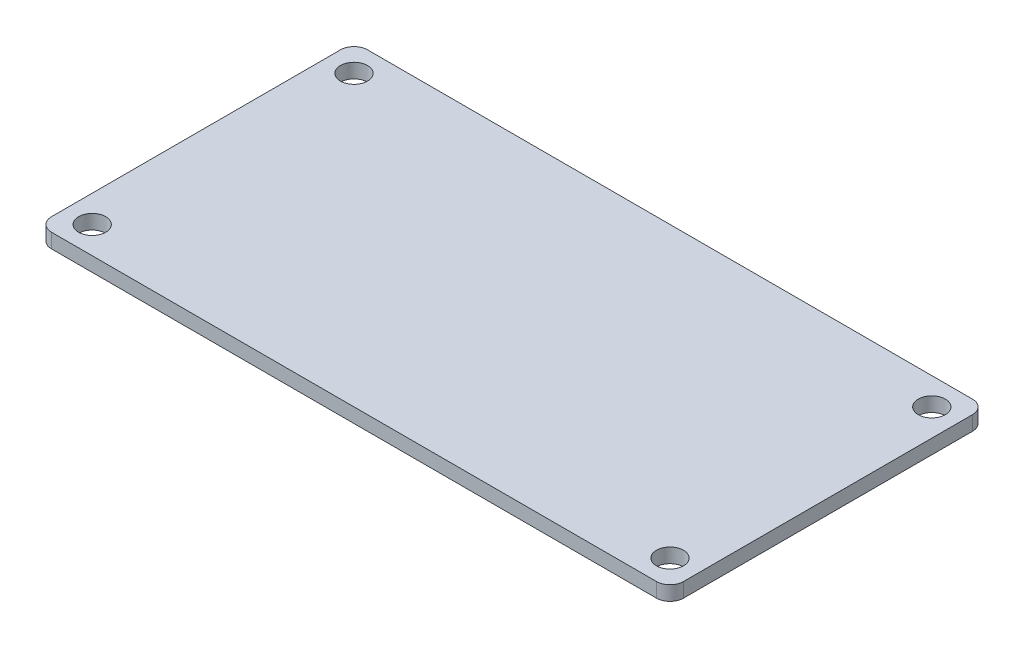
ISO-10303-21;
HEADER;
FILE_DESCRIPTION(('STEP AP214'),'2;1');
FILE_NAME('part.step','',(''),(''),'','','');
FILE_SCHEMA(('AUTOMOTIVE_DESIGN { 1 0 10303 214 1 1 1 1 }'));
ENDSEC;
DATA;
#1=APPLICATION_CONTEXT('core data for automotive mechanical design processes');
#2=APPLICATION_PROTOCOL_DEFINITION('international standard','automotive_design',2000,#1);
#3=PRODUCT_CONTEXT('',#1,'mechanical');
#4=PRODUCT('Part','Part','',(#3));
#5=PRODUCT_RELATED_PRODUCT_CATEGORY('part','',(#4));
#6=PRODUCT_DEFINITION_FORMATION('','',#4);
#7=PRODUCT_DEFINITION_CONTEXT('part definition',#1,'design');
#8=PRODUCT_DEFINITION('design','',#6,#7);
#9=PRODUCT_DEFINITION_SHAPE('','',#8);
#10=(LENGTH_UNIT() NAMED_UNIT(*) SI_UNIT(.MILLI.,.METRE.));
#11=(NAMED_UNIT(*) PLANE_ANGLE_UNIT() SI_UNIT($,.RADIAN.));
#12=(NAMED_UNIT(*) SI_UNIT($,.STERADIAN.) SOLID_ANGLE_UNIT());
#13=UNCERTAINTY_MEASURE_WITH_UNIT(LENGTH_MEASURE(1.E-05),#10,'distance_accuracy_value','');
#14=(GEOMETRIC_REPRESENTATION_CONTEXT(3) GLOBAL_UNCERTAINTY_ASSIGNED_CONTEXT((#13)) GLOBAL_UNIT_ASSIGNED_CONTEXT((#10,
#11,#12)) REPRESENTATION_CONTEXT('',''));
#15=CARTESIAN_POINT('',(0.,0.,0.));
#16=DIRECTION('',(0.,0.,1.));
#17=DIRECTION('',(1.,0.,0.));
#18=AXIS2_PLACEMENT_3D('',#15,#16,#17);
#19=CARTESIAN_POINT('',(-33.5,1.6,16.));
#20=DIRECTION('',(0.,-1.,0.));
#21=DIRECTION('',(0.,0.,-1.));
#22=AXIS2_PLACEMENT_3D('',#19,#20,#21);
#23=CYLINDRICAL_SURFACE('',#22,1.5);
#24=CARTESIAN_POINT('',(-33.5,0.,16.));
#25=DIRECTION('',(0.,1.,0.));
#26=DIRECTION('',(0.,0.,-1.));
#27=AXIS2_PLACEMENT_3D('',#24,#25,#26);
#28=CIRCLE('',#27,1.5);
#29=CARTESIAN_POINT('',(-35.,0.,16.));
#30=VERTEX_POINT('',#29);
#31=CARTESIAN_POINT('',(-33.5,0.,17.5));
#32=VERTEX_POINT('',#31);
#33=EDGE_CURVE('E131',#30,#32,#28,.T.);
#34=ORIENTED_EDGE('',*,*,#33,.T.);
#35=DIRECTION('',(0.,-1.,0.));
#36=VECTOR('',#35,1.);
#37=CARTESIAN_POINT('',(-33.5,1.6,17.5));
#38=LINE('',#37,#36);
#39=CARTESIAN_POINT('',(-33.5,1.6,17.5));
#40=VERTEX_POINT('',#39);
#41=EDGE_CURVE('E11',#40,#32,#38,.T.);
#42=ORIENTED_EDGE('',*,*,#41,.F.);
#43=CARTESIAN_POINT('',(-33.5,1.6,16.));
#44=DIRECTION('',(0.,1.,0.));
#45=DIRECTION('',(0.,0.,-1.));
#46=AXIS2_PLACEMENT_3D('',#43,#44,#45);
#47=CIRCLE('',#46,1.5);
#48=CARTESIAN_POINT('',(-35.,1.6,16.));
#49=VERTEX_POINT('',#48);
#50=EDGE_CURVE('E146',#49,#40,#47,.T.);
#51=ORIENTED_EDGE('',*,*,#50,.F.);
#52=DIRECTION('',(0.,-1.,0.));
#53=VECTOR('',#52,1.);
#54=CARTESIAN_POINT('',(-35.,1.6,16.));
#55=LINE('',#54,#53);
#56=EDGE_CURVE('E127',#49,#30,#55,.T.);
#57=ORIENTED_EDGE('',*,*,#56,.T.);
#58=EDGE_LOOP('',(#34,#42,#51,#57));
#59=FACE_BOUND('',#58,.T.);
#60=ADVANCED_FACE('F35',(#59),#23,.T.);
#61=CARTESIAN_POINT('',(-33.5,1.6,17.5));
#62=DIRECTION('',(0.,0.,-1.));
#63=DIRECTION('',(-1.,0.,0.));
#64=AXIS2_PLACEMENT_3D('',#61,#62,#63);
#65=PLANE('',#64);
#66=DIRECTION('',(1.,0.,0.));
#67=VECTOR('',#66,1.);
#68=CARTESIAN_POINT('',(-33.5,0.,17.5));
#69=LINE('',#68,#67);
#70=CARTESIAN_POINT('',(33.5,0.,17.5));
#71=VERTEX_POINT('',#70);
#72=EDGE_CURVE('E134',#32,#71,#69,.T.);
#73=ORIENTED_EDGE('',*,*,#72,.T.);
#74=DIRECTION('',(0.,-1.,0.));
#75=VECTOR('',#74,1.);
#76=CARTESIAN_POINT('',(33.5,1.6,17.5));
#77=LINE('',#76,#75);
#78=CARTESIAN_POINT('',(33.5,1.6,17.5));
#79=VERTEX_POINT('',#78);
#80=EDGE_CURVE('E43',#79,#71,#77,.T.);
#81=ORIENTED_EDGE('',*,*,#80,.F.);
#82=DIRECTION('',(1.,0.,0.));
#83=VECTOR('',#82,1.);
#84=CARTESIAN_POINT('',(-33.5,1.6,17.5));
#85=LINE('',#84,#83);
#86=EDGE_CURVE('E94',#40,#79,#85,.T.);
#87=ORIENTED_EDGE('',*,*,#86,.F.);
#88=ORIENTED_EDGE('',*,*,#41,.T.);
#89=EDGE_LOOP('',(#73,#81,#87,#88));
#90=FACE_BOUND('',#89,.T.);
#91=ADVANCED_FACE('F227',(#90),#65,.F.);
#92=CARTESIAN_POINT('',(33.5,1.6,16.));
#93=DIRECTION('',(0.,-1.,0.));
#94=DIRECTION('',(0.,0.,-1.));
#95=AXIS2_PLACEMENT_3D('',#92,#93,#94);
#96=CYLINDRICAL_SURFACE('',#95,1.5);
#97=CARTESIAN_POINT('',(33.5,0.,16.));
#98=DIRECTION('',(0.,1.,0.));
#99=DIRECTION('',(0.,0.,1.));
#100=AXIS2_PLACEMENT_3D('',#97,#98,#99);
#101=CIRCLE('',#100,1.5);
#102=CARTESIAN_POINT('',(35.,0.,16.));
#103=VERTEX_POINT('',#102);
#104=EDGE_CURVE('E137',#71,#103,#101,.T.);
#105=ORIENTED_EDGE('',*,*,#104,.T.);
#106=DIRECTION('',(0.,-1.,0.));
#107=VECTOR('',#106,1.);
#108=CARTESIAN_POINT('',(35.,1.6,16.));
#109=LINE('',#108,#107);
#110=CARTESIAN_POINT('',(35.,1.6,16.));
#111=VERTEX_POINT('',#110);
#112=EDGE_CURVE('E153',#111,#103,#109,.T.);
#113=ORIENTED_EDGE('',*,*,#112,.F.);
#114=CARTESIAN_POINT('',(33.5,1.6,16.));
#115=DIRECTION('',(0.,1.,0.));
#116=DIRECTION('',(0.,0.,1.));
#117=AXIS2_PLACEMENT_3D('',#114,#115,#116);
#118=CIRCLE('',#117,1.5);
#119=EDGE_CURVE('E161',#79,#111,#118,.T.);
#120=ORIENTED_EDGE('',*,*,#119,.F.);
#121=ORIENTED_EDGE('',*,*,#80,.T.);
#122=EDGE_LOOP('',(#105,#113,#120,#121));
#123=FACE_BOUND('',#122,.T.);
#124=ADVANCED_FACE('F159',(#123),#96,.T.);
#125=CARTESIAN_POINT('',(35.,1.6,16.));
#126=DIRECTION('',(-1.,0.,0.));
#127=DIRECTION('',(0.,0.,1.));
#128=AXIS2_PLACEMENT_3D('',#125,#126,#127);
#129=PLANE('',#128);
#130=DIRECTION('',(0.,0.,-1.));
#131=VECTOR('',#130,1.);
#132=CARTESIAN_POINT('',(35.,0.,16.));
#133=LINE('',#132,#131);
#134=CARTESIAN_POINT('',(35.,0.,-16.));
#135=VERTEX_POINT('',#134);
#136=EDGE_CURVE('E139',#103,#135,#133,.T.);
#137=ORIENTED_EDGE('',*,*,#136,.T.);
#138=DIRECTION('',(0.,-1.,0.));
#139=VECTOR('',#138,1.);
#140=CARTESIAN_POINT('',(35.,1.6,-16.));
#141=LINE('',#140,#139);
#142=CARTESIAN_POINT('',(35.,1.6,-16.));
#143=VERTEX_POINT('',#142);
#144=EDGE_CURVE('E150',#143,#135,#141,.T.);
#145=ORIENTED_EDGE('',*,*,#144,.F.);
#146=DIRECTION('',(0.,0.,-1.));
#147=VECTOR('',#146,1.);
#148=CARTESIAN_POINT('',(35.,1.6,16.));
#149=LINE('',#148,#147);
#150=EDGE_CURVE('E173',#111,#143,#149,.T.);
#151=ORIENTED_EDGE('',*,*,#150,.F.);
#152=ORIENTED_EDGE('',*,*,#112,.T.);
#153=EDGE_LOOP('',(#137,#145,#151,#152));
#154=FACE_BOUND('',#153,.T.);
#155=ADVANCED_FACE('F169',(#154),#129,.F.);
#156=CARTESIAN_POINT('',(33.5,1.6,-16.));
#157=DIRECTION('',(0.,-1.,0.));
#158=DIRECTION('',(0.,0.,-1.));
#159=AXIS2_PLACEMENT_3D('',#156,#157,#158);
#160=CYLINDRICAL_SURFACE('',#159,1.5);
#161=CARTESIAN_POINT('',(33.5,0.,-16.));
#162=DIRECTION('',(0.,1.,0.));
#163=DIRECTION('',(0.,0.,-1.));
#164=AXIS2_PLACEMENT_3D('',#161,#162,#163);
#165=CIRCLE('',#164,1.5);
#166=CARTESIAN_POINT('',(33.5,0.,-17.5));
#167=VERTEX_POINT('',#166);
#168=EDGE_CURVE('E141',#135,#167,#165,.T.);
#169=ORIENTED_EDGE('',*,*,#168,.T.);
#170=DIRECTION('',(0.,-1.,0.));
#171=VECTOR('',#170,1.);
#172=CARTESIAN_POINT('',(33.5,1.6,-17.5));
#173=LINE('',#172,#171);
#174=CARTESIAN_POINT('',(33.5,1.6,-17.5));
#175=VERTEX_POINT('',#174);
#176=EDGE_CURVE('E122',#175,#167,#173,.T.);
#177=ORIENTED_EDGE('',*,*,#176,.F.);
#178=CARTESIAN_POINT('',(33.5,1.6,-16.));
#179=DIRECTION('',(0.,1.,0.));
#180=DIRECTION('',(0.,0.,-1.));
#181=AXIS2_PLACEMENT_3D('',#178,#179,#180);
#182=CIRCLE('',#181,1.5);
#183=EDGE_CURVE('E113',#143,#175,#182,.T.);
#184=ORIENTED_EDGE('',*,*,#183,.F.);
#185=ORIENTED_EDGE('',*,*,#144,.T.);
#186=EDGE_LOOP('',(#169,#177,#184,#185));
#187=FACE_BOUND('',#186,.T.);
#188=ADVANCED_FACE('F172',(#187),#160,.T.);
#189=CARTESIAN_POINT('',(-33.5,1.6,-17.5));
#190=DIRECTION('',(0.,0.,1.));
#191=DIRECTION('',(1.,0.,0.));
#192=AXIS2_PLACEMENT_3D('',#189,#190,#191);
#193=PLANE('',#192);
#194=DIRECTION('',(-1.,0.,0.));
#195=VECTOR('',#194,1.);
#196=CARTESIAN_POINT('',(-33.5,0.,-17.5));
#197=LINE('',#196,#195);
#198=CARTESIAN_POINT('',(-33.5,0.,-17.5));
#199=VERTEX_POINT('',#198);
#200=EDGE_CURVE('E121',#167,#199,#197,.T.);
#201=ORIENTED_EDGE('',*,*,#200,.T.);
#202=DIRECTION('',(0.,-1.,0.));
#203=VECTOR('',#202,1.);
#204=CARTESIAN_POINT('',(-33.5,1.6,-17.5));
#205=LINE('',#204,#203);
#206=CARTESIAN_POINT('',(-33.5,1.6,-17.5));
#207=VERTEX_POINT('',#206);
#208=EDGE_CURVE('E118',#207,#199,#205,.T.);
#209=ORIENTED_EDGE('',*,*,#208,.F.);
#210=DIRECTION('',(-1.,0.,0.));
#211=VECTOR('',#210,1.);
#212=CARTESIAN_POINT('',(-33.5,1.6,-17.5));
#213=LINE('',#212,#211);
#214=EDGE_CURVE('E107',#175,#207,#213,.T.);
#215=ORIENTED_EDGE('',*,*,#214,.F.);
#216=ORIENTED_EDGE('',*,*,#176,.T.);
#217=EDGE_LOOP('',(#201,#209,#215,#216));
#218=FACE_BOUND('',#217,.T.);
#219=ADVANCED_FACE('F119',(#218),#193,.F.);
#220=CARTESIAN_POINT('',(-33.5,1.6,-16.));
#221=DIRECTION('',(0.,-1.,0.));
#222=DIRECTION('',(0.,0.,-1.));
#223=AXIS2_PLACEMENT_3D('',#220,#221,#222);
#224=CYLINDRICAL_SURFACE('',#223,1.5);
#225=CARTESIAN_POINT('',(-33.5,0.,-16.));
#226=DIRECTION('',(0.,1.,0.));
#227=DIRECTION('',(0.,0.,-1.));
#228=AXIS2_PLACEMENT_3D('',#225,#226,#227);
#229=CIRCLE('',#228,1.5);
#230=CARTESIAN_POINT('',(-35.,0.,-16.));
#231=VERTEX_POINT('',#230);
#232=EDGE_CURVE('E80',#199,#231,#229,.T.);
#233=ORIENTED_EDGE('',*,*,#232,.T.);
#234=DIRECTION('',(0.,-1.,0.));
#235=VECTOR('',#234,1.);
#236=CARTESIAN_POINT('',(-35.,1.6,-16.));
#237=LINE('',#236,#235);
#238=CARTESIAN_POINT('',(-35.,1.6,-16.));
#239=VERTEX_POINT('',#238);
#240=EDGE_CURVE('E123',#239,#231,#237,.T.);
#241=ORIENTED_EDGE('',*,*,#240,.F.);
#242=CARTESIAN_POINT('',(-33.5,1.6,-16.));
#243=DIRECTION('',(0.,1.,0.));
#244=DIRECTION('',(0.,0.,-1.));
#245=AXIS2_PLACEMENT_3D('',#242,#243,#244);
#246=CIRCLE('',#245,1.5);
#247=EDGE_CURVE('E111',#207,#239,#246,.T.);
#248=ORIENTED_EDGE('',*,*,#247,.F.);
#249=ORIENTED_EDGE('',*,*,#208,.T.);
#250=EDGE_LOOP('',(#233,#241,#248,#249));
#251=FACE_BOUND('',#250,.T.);
#252=ADVANCED_FACE('F125',(#251),#224,.T.);
#253=CARTESIAN_POINT('',(-35.,1.6,16.));
#254=DIRECTION('',(1.,0.,0.));
#255=DIRECTION('',(0.,0.,-1.));
#256=AXIS2_PLACEMENT_3D('',#253,#254,#255);
#257=PLANE('',#256);
#258=DIRECTION('',(0.,0.,1.));
#259=VECTOR('',#258,1.);
#260=CARTESIAN_POINT('',(-35.,0.,16.));
#261=LINE('',#260,#259);
#262=EDGE_CURVE('E86',#231,#30,#261,.T.);
#263=ORIENTED_EDGE('',*,*,#262,.T.);
#264=ORIENTED_EDGE('',*,*,#56,.F.);
#265=DIRECTION('',(0.,0.,1.));
#266=VECTOR('',#265,1.);
#267=CARTESIAN_POINT('',(-35.,1.6,16.));
#268=LINE('',#267,#266);
#269=EDGE_CURVE('E51',#239,#49,#268,.T.);
#270=ORIENTED_EDGE('',*,*,#269,.F.);
#271=ORIENTED_EDGE('',*,*,#240,.T.);
#272=EDGE_LOOP('',(#263,#264,#270,#271));
#273=FACE_BOUND('',#272,.T.);
#274=ADVANCED_FACE('F208',(#273),#257,.F.);
#275=CARTESIAN_POINT('',(-33.5,1.6,16.));
#276=DIRECTION('',(0.,-1.,0.));
#277=DIRECTION('',(0.,0.,-1.));
#278=AXIS2_PLACEMENT_3D('',#275,#276,#277);
#279=PLANE('',#278);
#280=CARTESIAN_POINT('',(-32.,1.6,14.5));
#281=DIRECTION('',(0.,1.,0.));
#282=DIRECTION('',(0.,0.,-1.));
#283=AXIS2_PLACEMENT_3D('',#280,#281,#282);
#284=CIRCLE('',#283,1.5);
#285=CARTESIAN_POINT('',(-32.,1.6,13.));
#286=VERTEX_POINT('',#285);
#287=EDGE_CURVE('E189',#286,#286,#284,.T.);
#288=ORIENTED_EDGE('',*,*,#287,.F.);
#289=EDGE_LOOP('',(#288));
#290=FACE_BOUND('',#289,.T.);
#291=CARTESIAN_POINT('',(32.,1.6,14.5));
#292=DIRECTION('',(0.,1.,0.));
#293=DIRECTION('',(0.,0.,1.));
#294=AXIS2_PLACEMENT_3D('',#291,#292,#293);
#295=CIRCLE('',#294,1.5);
#296=CARTESIAN_POINT('',(32.,1.6,16.));
#297=VERTEX_POINT('',#296);
#298=EDGE_CURVE('E188',#297,#297,#295,.T.);
#299=ORIENTED_EDGE('',*,*,#298,.F.);
#300=EDGE_LOOP('',(#299));
#301=FACE_BOUND('',#300,.T.);
#302=CARTESIAN_POINT('',(32.,1.6,-14.5));
#303=DIRECTION('',(0.,1.,0.));
#304=DIRECTION('',(0.,0.,-1.));
#305=AXIS2_PLACEMENT_3D('',#302,#303,#304);
#306=CIRCLE('',#305,1.5);
#307=CARTESIAN_POINT('',(32.,1.6,-16.));
#308=VERTEX_POINT('',#307);
#309=EDGE_CURVE('E195',#308,#308,#306,.T.);
#310=ORIENTED_EDGE('',*,*,#309,.F.);
#311=EDGE_LOOP('',(#310));
#312=FACE_BOUND('',#311,.T.);
#313=CARTESIAN_POINT('',(-32.,1.6,-14.5));
#314=DIRECTION('',(0.,1.,0.));
#315=DIRECTION('',(0.,0.,1.));
#316=AXIS2_PLACEMENT_3D('',#313,#314,#315);
#317=CIRCLE('',#316,1.5);
#318=CARTESIAN_POINT('',(-32.,1.6,-13.));
#319=VERTEX_POINT('',#318);
#320=EDGE_CURVE('E181',#319,#319,#317,.T.);
#321=ORIENTED_EDGE('',*,*,#320,.F.);
#322=EDGE_LOOP('',(#321));
#323=FACE_BOUND('',#322,.T.);
#324=ORIENTED_EDGE('',*,*,#50,.T.);
#325=ORIENTED_EDGE('',*,*,#86,.T.);
#326=ORIENTED_EDGE('',*,*,#119,.T.);
#327=ORIENTED_EDGE('',*,*,#150,.T.);
#328=ORIENTED_EDGE('',*,*,#183,.T.);
#329=ORIENTED_EDGE('',*,*,#214,.T.);
#330=ORIENTED_EDGE('',*,*,#247,.T.);
#331=ORIENTED_EDGE('',*,*,#269,.T.);
#332=EDGE_LOOP('',(#324,#325,#326,#327,#328,#329,#330,#331));
#333=FACE_BOUND('',#332,.T.);
#334=ADVANCED_FACE('F109',(#290,#301,#312,#323,#333),#279,.F.);
#335=CARTESIAN_POINT('',(-33.5,0.,16.));
#336=DIRECTION('',(0.,-1.,0.));
#337=DIRECTION('',(0.,0.,-1.));
#338=AXIS2_PLACEMENT_3D('',#335,#336,#337);
#339=PLANE('',#338);
#340=CARTESIAN_POINT('',(-32.,0.,14.5));
#341=DIRECTION('',(0.,-1.,0.));
#342=DIRECTION('',(0.,0.,-1.));
#343=AXIS2_PLACEMENT_3D('',#340,#341,#342);
#344=CIRCLE('',#343,1.5);
#345=CARTESIAN_POINT('',(-32.,0.,13.));
#346=VERTEX_POINT('',#345);
#347=EDGE_CURVE('E185',#346,#346,#344,.F.);
#348=ORIENTED_EDGE('',*,*,#347,.T.);
#349=EDGE_LOOP('',(#348));
#350=FACE_BOUND('',#349,.T.);
#351=CARTESIAN_POINT('',(32.,0.,14.5));
#352=DIRECTION('',(0.,-1.,0.));
#353=DIRECTION('',(0.,0.,-1.));
#354=AXIS2_PLACEMENT_3D('',#351,#352,#353);
#355=CIRCLE('',#354,1.5);
#356=CARTESIAN_POINT('',(32.,0.,13.));
#357=VERTEX_POINT('',#356);
#358=EDGE_CURVE('E192',#357,#357,#355,.F.);
#359=ORIENTED_EDGE('',*,*,#358,.T.);
#360=EDGE_LOOP('',(#359));
#361=FACE_BOUND('',#360,.T.);
#362=CARTESIAN_POINT('',(32.,0.,-14.5));
#363=DIRECTION('',(0.,-1.,0.));
#364=DIRECTION('',(0.,0.,-1.));
#365=AXIS2_PLACEMENT_3D('',#362,#363,#364);
#366=CIRCLE('',#365,1.5);
#367=CARTESIAN_POINT('',(32.,0.,-16.));
#368=VERTEX_POINT('',#367);
#369=EDGE_CURVE('E184',#368,#368,#366,.F.);
#370=ORIENTED_EDGE('',*,*,#369,.T.);
#371=EDGE_LOOP('',(#370));
#372=FACE_BOUND('',#371,.T.);
#373=CARTESIAN_POINT('',(-32.,0.,-14.5));
#374=DIRECTION('',(0.,-1.,0.));
#375=DIRECTION('',(0.,0.,-1.));
#376=AXIS2_PLACEMENT_3D('',#373,#374,#375);
#377=CIRCLE('',#376,1.5);
#378=CARTESIAN_POINT('',(-32.,0.,-16.));
#379=VERTEX_POINT('',#378);
#380=EDGE_CURVE('E135',#379,#379,#377,.F.);
#381=ORIENTED_EDGE('',*,*,#380,.T.);
#382=EDGE_LOOP('',(#381));
#383=FACE_BOUND('',#382,.T.);
#384=ORIENTED_EDGE('',*,*,#33,.F.);
#385=ORIENTED_EDGE('',*,*,#262,.F.);
#386=ORIENTED_EDGE('',*,*,#232,.F.);
#387=ORIENTED_EDGE('',*,*,#200,.F.);
#388=ORIENTED_EDGE('',*,*,#168,.F.);
#389=ORIENTED_EDGE('',*,*,#136,.F.);
#390=ORIENTED_EDGE('',*,*,#104,.F.);
#391=ORIENTED_EDGE('',*,*,#72,.F.);
#392=EDGE_LOOP('',(#384,#385,#386,#387,#388,#389,#390,#391));
#393=FACE_BOUND('',#392,.T.);
#394=ADVANCED_FACE('F165',(#350,#361,#372,#383,#393),#339,.T.);
#395=CARTESIAN_POINT('',(-32.,-4.2426406871193,-14.5));
#396=DIRECTION('',(0.,1.,0.));
#397=DIRECTION('',(0.,0.,1.));
#398=AXIS2_PLACEMENT_3D('',#395,#396,#397);
#399=CYLINDRICAL_SURFACE('',#398,1.5);
#400=ORIENTED_EDGE('',*,*,#320,.T.);
#401=EDGE_LOOP('',(#400));
#402=FACE_BOUND('',#401,.T.);
#403=ORIENTED_EDGE('',*,*,#380,.F.);
#404=EDGE_LOOP('',(#403));
#405=FACE_BOUND('',#404,.T.);
#406=ADVANCED_FACE('F213',(#402,#405),#399,.F.);
#407=CARTESIAN_POINT('',(32.,-4.2426406871193,-14.5));
#408=DIRECTION('',(0.,1.,0.));
#409=DIRECTION('',(0.,0.,1.));
#410=AXIS2_PLACEMENT_3D('',#407,#408,#409);
#411=CYLINDRICAL_SURFACE('',#410,1.5);
#412=ORIENTED_EDGE('',*,*,#309,.T.);
#413=EDGE_LOOP('',(#412));
#414=FACE_BOUND('',#413,.T.);
#415=ORIENTED_EDGE('',*,*,#369,.F.);
#416=EDGE_LOOP('',(#415));
#417=FACE_BOUND('',#416,.T.);
#418=ADVANCED_FACE('F203',(#414,#417),#411,.F.);
#419=CARTESIAN_POINT('',(32.,-4.2426406871193,14.5));
#420=DIRECTION('',(0.,1.,0.));
#421=DIRECTION('',(0.,0.,1.));
#422=AXIS2_PLACEMENT_3D('',#419,#420,#421);
#423=CYLINDRICAL_SURFACE('',#422,1.5);
#424=ORIENTED_EDGE('',*,*,#298,.T.);
#425=EDGE_LOOP('',(#424));
#426=FACE_BOUND('',#425,.T.);
#427=ORIENTED_EDGE('',*,*,#358,.F.);
#428=EDGE_LOOP('',(#427));
#429=FACE_BOUND('',#428,.T.);
#430=ADVANCED_FACE('F296',(#426,#429),#423,.F.);
#431=CARTESIAN_POINT('',(-32.,-4.2426406871193,14.5));
#432=DIRECTION('',(0.,1.,0.));
#433=DIRECTION('',(0.,0.,1.));
#434=AXIS2_PLACEMENT_3D('',#431,#432,#433);
#435=CYLINDRICAL_SURFACE('',#434,1.5);
#436=ORIENTED_EDGE('',*,*,#287,.T.);
#437=EDGE_LOOP('',(#436));
#438=FACE_BOUND('',#437,.T.);
#439=ORIENTED_EDGE('',*,*,#347,.F.);
#440=EDGE_LOOP('',(#439));
#441=FACE_BOUND('',#440,.T.);
#442=ADVANCED_FACE('F305',(#438,#441),#435,.F.);
#443=CLOSED_SHELL('',(#60,#91,#124,#155,#188,#219,#252,#274,#334,#394,#406,#418,#430,#442));
#444=MANIFOLD_SOLID_BREP('B2',#443);
#445=ADVANCED_BREP_SHAPE_REPRESENTATION('',(#18,#444),#14);
#446=SHAPE_DEFINITION_REPRESENTATION(#9,#445);
ENDSEC;
END-ISO-10303-21;
